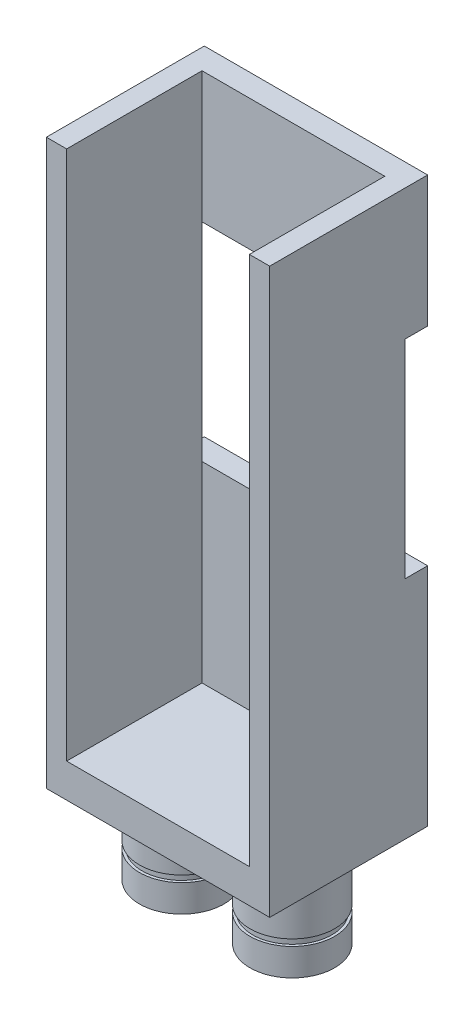
ISO-10303-21;
HEADER;
FILE_DESCRIPTION(('STEP AP214'),'2;1');
FILE_NAME('part.step','',(''),(''),'','','');
FILE_SCHEMA(('AUTOMOTIVE_DESIGN { 1 0 10303 214 1 1 1 1 }'));
ENDSEC;
DATA;
#1=APPLICATION_CONTEXT('core data for automotive mechanical design processes');
#2=APPLICATION_PROTOCOL_DEFINITION('international standard','automotive_design',2000,#1);
#3=PRODUCT_CONTEXT('',#1,'mechanical');
#4=PRODUCT('Part','Part','',(#3));
#5=PRODUCT_RELATED_PRODUCT_CATEGORY('part','',(#4));
#6=PRODUCT_DEFINITION_FORMATION('','',#4);
#7=PRODUCT_DEFINITION_CONTEXT('part definition',#1,'design');
#8=PRODUCT_DEFINITION('design','',#6,#7);
#9=PRODUCT_DEFINITION_SHAPE('','',#8);
#10=(LENGTH_UNIT() NAMED_UNIT(*) SI_UNIT(.MILLI.,.METRE.));
#11=(NAMED_UNIT(*) PLANE_ANGLE_UNIT() SI_UNIT($,.RADIAN.));
#12=(NAMED_UNIT(*) SI_UNIT($,.STERADIAN.) SOLID_ANGLE_UNIT());
#13=UNCERTAINTY_MEASURE_WITH_UNIT(LENGTH_MEASURE(1.E-05),#10,'distance_accuracy_value','');
#14=(GEOMETRIC_REPRESENTATION_CONTEXT(3) GLOBAL_UNCERTAINTY_ASSIGNED_CONTEXT((#13)) GLOBAL_UNIT_ASSIGNED_CONTEXT((#10,
#11,#12)) REPRESENTATION_CONTEXT('',''));
#15=CARTESIAN_POINT('',(0.,0.,0.));
#16=DIRECTION('',(0.,0.,1.));
#17=DIRECTION('',(1.,0.,0.));
#18=AXIS2_PLACEMENT_3D('',#15,#16,#17);
#19=CARTESIAN_POINT('',(-12.573,63.5,-8.89));
#20=DIRECTION('',(0.,0.,1.));
#21=DIRECTION('',(1.,0.,0.));
#22=AXIS2_PLACEMENT_3D('',#19,#20,#21);
#23=PLANE('',#22);
#24=DIRECTION('',(0.,-1.,0.));
#25=VECTOR('',#24,1.);
#26=CARTESIAN_POINT('',(12.573,63.5,-8.89));
#27=LINE('',#26,#25);
#28=CARTESIAN_POINT('',(12.573,63.5,-8.89));
#29=VERTEX_POINT('',#28);
#30=CARTESIAN_POINT('',(12.573,48.768,-8.89));
#31=VERTEX_POINT('',#30);
#32=EDGE_CURVE('E170',#29,#31,#27,.T.);
#33=ORIENTED_EDGE('',*,*,#32,.T.);
#34=DIRECTION('',(1.,0.,0.));
#35=VECTOR('',#34,1.);
#36=CARTESIAN_POINT('',(12.573,48.768,-8.89));
#37=LINE('',#36,#35);
#38=CARTESIAN_POINT('',(-12.573,48.768,-8.89));
#39=VERTEX_POINT('',#38);
#40=EDGE_CURVE('E144',#39,#31,#37,.T.);
#41=ORIENTED_EDGE('',*,*,#40,.F.);
#42=DIRECTION('',(0.,-1.,0.));
#43=VECTOR('',#42,1.);
#44=CARTESIAN_POINT('',(-12.573,63.5,-8.89));
#45=LINE('',#44,#43);
#46=CARTESIAN_POINT('',(-12.573,63.5,-8.89));
#47=VERTEX_POINT('',#46);
#48=EDGE_CURVE('E162',#47,#39,#45,.T.);
#49=ORIENTED_EDGE('',*,*,#48,.F.);
#50=DIRECTION('',(-1.,0.,0.));
#51=VECTOR('',#50,1.);
#52=CARTESIAN_POINT('',(-12.573,63.5,-8.89));
#53=LINE('',#52,#51);
#54=EDGE_CURVE('E181',#29,#47,#53,.T.);
#55=ORIENTED_EDGE('',*,*,#54,.F.);
#56=EDGE_LOOP('',(#33,#41,#49,#55));
#57=FACE_BOUND('',#56,.T.);
#58=ADVANCED_FACE('F36',(#57),#23,.F.);
#59=CARTESIAN_POINT('',(-10.287,3.81,-6.35));
#60=DIRECTION('',(0.,0.,-1.));
#61=DIRECTION('',(-1.,0.,0.));
#62=AXIS2_PLACEMENT_3D('',#59,#60,#61);
#63=PLANE('',#62);
#64=DIRECTION('',(0.,1.,0.));
#65=VECTOR('',#64,1.);
#66=CARTESIAN_POINT('',(-10.287,3.81,-6.35));
#67=LINE('',#66,#65);
#68=CARTESIAN_POINT('',(-10.287,48.768,-6.35));
#69=VERTEX_POINT('',#68);
#70=CARTESIAN_POINT('',(-10.287,63.5,-6.35));
#71=VERTEX_POINT('',#70);
#72=EDGE_CURVE('E207',#69,#71,#67,.T.);
#73=ORIENTED_EDGE('',*,*,#72,.F.);
#74=DIRECTION('',(-1.,0.,0.));
#75=VECTOR('',#74,1.);
#76=CARTESIAN_POINT('',(12.573,48.768,-6.35));
#77=LINE('',#76,#75);
#78=CARTESIAN_POINT('',(10.287,48.768,-6.35));
#79=VERTEX_POINT('',#78);
#80=EDGE_CURVE('E247',#79,#69,#77,.T.);
#81=ORIENTED_EDGE('',*,*,#80,.F.);
#82=DIRECTION('',(0.,1.,0.));
#83=VECTOR('',#82,1.);
#84=CARTESIAN_POINT('',(10.287,3.81,-6.35));
#85=LINE('',#84,#83);
#86=CARTESIAN_POINT('',(10.287,63.5,-6.35));
#87=VERTEX_POINT('',#86);
#88=EDGE_CURVE('E202',#79,#87,#85,.T.);
#89=ORIENTED_EDGE('',*,*,#88,.T.);
#90=DIRECTION('',(-1.,0.,0.));
#91=VECTOR('',#90,1.);
#92=CARTESIAN_POINT('',(-10.287,63.5,-6.35));
#93=LINE('',#92,#91);
#94=EDGE_CURVE('E206',#87,#71,#93,.T.);
#95=ORIENTED_EDGE('',*,*,#94,.T.);
#96=EDGE_LOOP('',(#73,#81,#89,#95));
#97=FACE_BOUND('',#96,.T.);
#98=ADVANCED_FACE('F243',(#97),#63,.F.);
#99=CARTESIAN_POINT('',(-6.223,-10.16,0.));
#100=DIRECTION('',(0.,1.,0.));
#101=DIRECTION('',(0.,0.,1.));
#102=AXIS2_PLACEMENT_3D('',#99,#100,#101);
#103=CYLINDRICAL_SURFACE('',#102,4.7625);
#104=CARTESIAN_POINT('',(-6.223,0.,0.));
#105=DIRECTION('',(0.,1.,0.));
#106=DIRECTION('',(0.,0.,1.));
#107=AXIS2_PLACEMENT_3D('',#104,#105,#106);
#108=CIRCLE('',#107,4.7625);
#109=CARTESIAN_POINT('',(-6.223,0.,4.7625));
#110=VERTEX_POINT('',#109);
#111=EDGE_CURVE('E299',#110,#110,#108,.F.);
#112=ORIENTED_EDGE('',*,*,#111,.T.);
#113=EDGE_LOOP('',(#112));
#114=FACE_BOUND('',#113,.T.);
#115=CARTESIAN_POINT('',(-6.223,-6.35,0.));
#116=DIRECTION('',(0.,-1.,0.));
#117=DIRECTION('',(0.,0.,-1.));
#118=AXIS2_PLACEMENT_3D('',#115,#116,#117);
#119=CIRCLE('',#118,4.7625);
#120=CARTESIAN_POINT('',(-6.223,-6.35,-4.7625));
#121=VERTEX_POINT('',#120);
#122=EDGE_CURVE('E296',#121,#121,#119,.T.);
#123=ORIENTED_EDGE('',*,*,#122,.F.);
#124=EDGE_LOOP('',(#123));
#125=FACE_BOUND('',#124,.T.);
#126=ADVANCED_FACE('F326',(#114,#125),#103,.T.);
#127=CARTESIAN_POINT('',(6.223,-10.16,0.));
#128=DIRECTION('',(0.,1.,0.));
#129=DIRECTION('',(0.,0.,1.));
#130=AXIS2_PLACEMENT_3D('',#127,#128,#129);
#131=CYLINDRICAL_SURFACE('',#130,4.7625);
#132=CARTESIAN_POINT('',(6.223,0.,0.));
#133=DIRECTION('',(0.,1.,0.));
#134=DIRECTION('',(0.,0.,1.));
#135=AXIS2_PLACEMENT_3D('',#132,#133,#134);
#136=CIRCLE('',#135,4.7625);
#137=CARTESIAN_POINT('',(6.223,0.,4.7625));
#138=VERTEX_POINT('',#137);
#139=EDGE_CURVE('E166',#138,#138,#136,.F.);
#140=ORIENTED_EDGE('',*,*,#139,.T.);
#141=EDGE_LOOP('',(#140));
#142=FACE_BOUND('',#141,.T.);
#143=CARTESIAN_POINT('',(6.223,-6.35,0.));
#144=DIRECTION('',(0.,-1.,0.));
#145=DIRECTION('',(0.,0.,-1.));
#146=AXIS2_PLACEMENT_3D('',#143,#144,#145);
#147=CIRCLE('',#146,4.7625);
#148=CARTESIAN_POINT('',(6.223,-6.35,-4.7625));
#149=VERTEX_POINT('',#148);
#150=EDGE_CURVE('E216',#149,#149,#147,.T.);
#151=ORIENTED_EDGE('',*,*,#150,.F.);
#152=EDGE_LOOP('',(#151));
#153=FACE_BOUND('',#152,.T.);
#154=ADVANCED_FACE('F38',(#142,#153),#131,.T.);
#155=CARTESIAN_POINT('',(-12.573,63.5,-8.89));
#156=DIRECTION('',(1.,0.,0.));
#157=DIRECTION('',(0.,0.,-1.));
#158=AXIS2_PLACEMENT_3D('',#155,#156,#157);
#159=PLANE('',#158);
#160=ORIENTED_EDGE('',*,*,#48,.T.);
#161=DIRECTION('',(0.,0.,-1.));
#162=VECTOR('',#161,1.);
#163=CARTESIAN_POINT('',(-12.573,48.768,27.9776090049977));
#164=LINE('',#163,#162);
#165=CARTESIAN_POINT('',(-12.573,48.768,-6.35));
#166=VERTEX_POINT('',#165);
#167=EDGE_CURVE('E156',#166,#39,#164,.T.);
#168=ORIENTED_EDGE('',*,*,#167,.F.);
#169=DIRECTION('',(0.,-1.,0.));
#170=VECTOR('',#169,1.);
#171=CARTESIAN_POINT('',(-12.573,48.768,-6.35));
#172=LINE('',#171,#170);
#173=CARTESIAN_POINT('',(-12.573,25.4,-6.35));
#174=VERTEX_POINT('',#173);
#175=EDGE_CURVE('E155',#166,#174,#172,.T.);
#176=ORIENTED_EDGE('',*,*,#175,.T.);
#177=DIRECTION('',(0.,0.,-1.));
#178=VECTOR('',#177,1.);
#179=CARTESIAN_POINT('',(-12.573,25.4,27.9776090049977));
#180=LINE('',#179,#178);
#181=CARTESIAN_POINT('',(-12.573,25.4,-8.89));
#182=VERTEX_POINT('',#181);
#183=EDGE_CURVE('E139',#174,#182,#180,.T.);
#184=ORIENTED_EDGE('',*,*,#183,.T.);
#185=CARTESIAN_POINT('',(-12.573,0.,-8.89));
#186=VERTEX_POINT('',#185);
#187=EDGE_CURVE('E151',#182,#186,#45,.T.);
#188=ORIENTED_EDGE('',*,*,#187,.T.);
#189=DIRECTION('',(0.,0.,1.));
#190=VECTOR('',#189,1.);
#191=CARTESIAN_POINT('',(-12.573,0.,-8.89));
#192=LINE('',#191,#190);
#193=CARTESIAN_POINT('',(-12.573,0.,8.89));
#194=VERTEX_POINT('',#193);
#195=EDGE_CURVE('E163',#186,#194,#192,.T.);
#196=ORIENTED_EDGE('',*,*,#195,.T.);
#197=DIRECTION('',(0.,-1.,0.));
#198=VECTOR('',#197,1.);
#199=CARTESIAN_POINT('',(-12.573,63.5,8.89));
#200=LINE('',#199,#198);
#201=CARTESIAN_POINT('',(-12.573,63.5,8.89));
#202=VERTEX_POINT('',#201);
#203=EDGE_CURVE('E179',#202,#194,#200,.T.);
#204=ORIENTED_EDGE('',*,*,#203,.F.);
#205=DIRECTION('',(0.,0.,1.));
#206=VECTOR('',#205,1.);
#207=CARTESIAN_POINT('',(-12.573,63.5,-8.89));
#208=LINE('',#207,#206);
#209=EDGE_CURVE('E183',#47,#202,#208,.T.);
#210=ORIENTED_EDGE('',*,*,#209,.F.);
#211=EDGE_LOOP('',(#160,#168,#176,#184,#188,#196,#204,#210));
#212=FACE_BOUND('',#211,.T.);
#213=ADVANCED_FACE('F149',(#212),#159,.F.);
#214=CARTESIAN_POINT('',(-12.573,63.5,8.89));
#215=DIRECTION('',(0.,0.,-1.));
#216=DIRECTION('',(-1.,0.,0.));
#217=AXIS2_PLACEMENT_3D('',#214,#215,#216);
#218=PLANE('',#217);
#219=DIRECTION('',(1.,0.,0.));
#220=VECTOR('',#219,1.);
#221=CARTESIAN_POINT('',(-10.287,3.81,8.89));
#222=LINE('',#221,#220);
#223=CARTESIAN_POINT('',(-10.287,3.81,8.89));
#224=VERTEX_POINT('',#223);
#225=CARTESIAN_POINT('',(10.287,3.81,8.89));
#226=VERTEX_POINT('',#225);
#227=EDGE_CURVE('E219',#224,#226,#222,.T.);
#228=ORIENTED_EDGE('',*,*,#227,.F.);
#229=DIRECTION('',(0.,1.,0.));
#230=VECTOR('',#229,1.);
#231=CARTESIAN_POINT('',(-10.287,3.81,8.89));
#232=LINE('',#231,#230);
#233=CARTESIAN_POINT('',(-10.287,63.5,8.89));
#234=VERTEX_POINT('',#233);
#235=EDGE_CURVE('E165',#224,#234,#232,.T.);
#236=ORIENTED_EDGE('',*,*,#235,.T.);
#237=DIRECTION('',(1.,0.,0.));
#238=VECTOR('',#237,1.);
#239=CARTESIAN_POINT('',(-12.573,63.5,8.89));
#240=LINE('',#239,#238);
#241=EDGE_CURVE('E187',#202,#234,#240,.T.);
#242=ORIENTED_EDGE('',*,*,#241,.F.);
#243=ORIENTED_EDGE('',*,*,#203,.T.);
#244=DIRECTION('',(1.,0.,0.));
#245=VECTOR('',#244,1.);
#246=CARTESIAN_POINT('',(-12.573,0.,8.89));
#247=LINE('',#246,#245);
#248=CARTESIAN_POINT('',(12.573,0.,8.89));
#249=VERTEX_POINT('',#248);
#250=EDGE_CURVE('E178',#194,#249,#247,.T.);
#251=ORIENTED_EDGE('',*,*,#250,.T.);
#252=DIRECTION('',(0.,-1.,0.));
#253=VECTOR('',#252,1.);
#254=CARTESIAN_POINT('',(12.573,63.5,8.89));
#255=LINE('',#254,#253);
#256=CARTESIAN_POINT('',(12.573,63.5,8.89));
#257=VERTEX_POINT('',#256);
#258=EDGE_CURVE('E174',#257,#249,#255,.T.);
#259=ORIENTED_EDGE('',*,*,#258,.F.);
#260=CARTESIAN_POINT('',(10.287,63.5,8.89));
#261=VERTEX_POINT('',#260);
#262=EDGE_CURVE('E186',#261,#257,#240,.T.);
#263=ORIENTED_EDGE('',*,*,#262,.F.);
#264=DIRECTION('',(0.,1.,0.));
#265=VECTOR('',#264,1.);
#266=CARTESIAN_POINT('',(10.287,3.81,8.89));
#267=LINE('',#266,#265);
#268=EDGE_CURVE('E195',#226,#261,#267,.T.);
#269=ORIENTED_EDGE('',*,*,#268,.F.);
#270=EDGE_LOOP('',(#228,#236,#242,#243,#251,#259,#263,#269));
#271=FACE_BOUND('',#270,.T.);
#272=ADVANCED_FACE('F230',(#271),#218,.F.);
#273=CARTESIAN_POINT('',(12.573,63.5,-8.89));
#274=DIRECTION('',(-1.,0.,0.));
#275=DIRECTION('',(0.,0.,1.));
#276=AXIS2_PLACEMENT_3D('',#273,#274,#275);
#277=PLANE('',#276);
#278=DIRECTION('',(0.,1.,0.));
#279=VECTOR('',#278,1.);
#280=CARTESIAN_POINT('',(12.573,48.768,-6.35));
#281=LINE('',#280,#279);
#282=CARTESIAN_POINT('',(12.573,25.4,-6.35));
#283=VERTEX_POINT('',#282);
#284=CARTESIAN_POINT('',(12.573,48.768,-6.35));
#285=VERTEX_POINT('',#284);
#286=EDGE_CURVE('E261',#283,#285,#281,.T.);
#287=ORIENTED_EDGE('',*,*,#286,.T.);
#288=DIRECTION('',(0.,0.,-1.));
#289=VECTOR('',#288,1.);
#290=CARTESIAN_POINT('',(12.573,48.768,27.9776090049977));
#291=LINE('',#290,#289);
#292=EDGE_CURVE('E259',#285,#31,#291,.T.);
#293=ORIENTED_EDGE('',*,*,#292,.T.);
#294=ORIENTED_EDGE('',*,*,#32,.F.);
#295=DIRECTION('',(0.,0.,-1.));
#296=VECTOR('',#295,1.);
#297=CARTESIAN_POINT('',(12.573,63.5,-8.89));
#298=LINE('',#297,#296);
#299=EDGE_CURVE('E184',#257,#29,#298,.T.);
#300=ORIENTED_EDGE('',*,*,#299,.F.);
#301=ORIENTED_EDGE('',*,*,#258,.T.);
#302=DIRECTION('',(0.,0.,-1.));
#303=VECTOR('',#302,1.);
#304=CARTESIAN_POINT('',(12.573,0.,-8.89));
#305=LINE('',#304,#303);
#306=CARTESIAN_POINT('',(12.573,0.,-8.89));
#307=VERTEX_POINT('',#306);
#308=EDGE_CURVE('E175',#249,#307,#305,.T.);
#309=ORIENTED_EDGE('',*,*,#308,.T.);
#310=CARTESIAN_POINT('',(12.573,25.4,-8.89));
#311=VERTEX_POINT('',#310);
#312=EDGE_CURVE('E173',#311,#307,#27,.T.);
#313=ORIENTED_EDGE('',*,*,#312,.F.);
#314=DIRECTION('',(0.,0.,-1.));
#315=VECTOR('',#314,1.);
#316=CARTESIAN_POINT('',(12.573,25.4,27.9776090049977));
#317=LINE('',#316,#315);
#318=EDGE_CURVE('E53',#283,#311,#317,.T.);
#319=ORIENTED_EDGE('',*,*,#318,.F.);
#320=EDGE_LOOP('',(#287,#293,#294,#300,#301,#309,#313,#319));
#321=FACE_BOUND('',#320,.T.);
#322=ADVANCED_FACE('F312',(#321),#277,.F.);
#323=ORIENTED_EDGE('',*,*,#187,.F.);
#324=DIRECTION('',(-1.,0.,0.));
#325=VECTOR('',#324,1.);
#326=CARTESIAN_POINT('',(12.573,25.4,-8.89));
#327=LINE('',#326,#325);
#328=EDGE_CURVE('E136',#311,#182,#327,.T.);
#329=ORIENTED_EDGE('',*,*,#328,.F.);
#330=ORIENTED_EDGE('',*,*,#312,.T.);
#331=DIRECTION('',(-1.,0.,0.));
#332=VECTOR('',#331,1.);
#333=CARTESIAN_POINT('',(-12.573,0.,-8.89));
#334=LINE('',#333,#332);
#335=EDGE_CURVE('E160',#307,#186,#334,.T.);
#336=ORIENTED_EDGE('',*,*,#335,.T.);
#337=EDGE_LOOP('',(#323,#329,#330,#336));
#338=FACE_BOUND('',#337,.T.);
#339=ADVANCED_FACE('F158',(#338),#23,.F.);
#340=CARTESIAN_POINT('',(0.,63.5,0.));
#341=DIRECTION('',(0.,1.,0.));
#342=DIRECTION('',(0.,0.,1.));
#343=AXIS2_PLACEMENT_3D('',#340,#341,#342);
#344=PLANE('',#343);
#345=DIRECTION('',(0.,0.,1.));
#346=VECTOR('',#345,1.);
#347=CARTESIAN_POINT('',(-10.287,63.5,-6.35));
#348=LINE('',#347,#346);
#349=EDGE_CURVE('E190',#71,#234,#348,.T.);
#350=ORIENTED_EDGE('',*,*,#349,.F.);
#351=ORIENTED_EDGE('',*,*,#94,.F.);
#352=DIRECTION('',(0.,0.,-1.));
#353=VECTOR('',#352,1.);
#354=CARTESIAN_POINT('',(10.287,63.5,-6.35));
#355=LINE('',#354,#353);
#356=EDGE_CURVE('E197',#261,#87,#355,.T.);
#357=ORIENTED_EDGE('',*,*,#356,.F.);
#358=ORIENTED_EDGE('',*,*,#262,.T.);
#359=ORIENTED_EDGE('',*,*,#299,.T.);
#360=ORIENTED_EDGE('',*,*,#54,.T.);
#361=ORIENTED_EDGE('',*,*,#209,.T.);
#362=ORIENTED_EDGE('',*,*,#241,.T.);
#363=EDGE_LOOP('',(#350,#351,#357,#358,#359,#360,#361,#362));
#364=FACE_BOUND('',#363,.T.);
#365=ADVANCED_FACE('F240',(#364),#344,.T.);
#366=CARTESIAN_POINT('',(0.,0.,0.));
#367=DIRECTION('',(0.,1.,0.));
#368=DIRECTION('',(0.,0.,1.));
#369=AXIS2_PLACEMENT_3D('',#366,#367,#368);
#370=PLANE('',#369);
#371=ORIENTED_EDGE('',*,*,#139,.F.);
#372=EDGE_LOOP('',(#371));
#373=FACE_BOUND('',#372,.T.);
#374=ORIENTED_EDGE('',*,*,#111,.F.);
#375=EDGE_LOOP('',(#374));
#376=FACE_BOUND('',#375,.T.);
#377=ORIENTED_EDGE('',*,*,#195,.F.);
#378=ORIENTED_EDGE('',*,*,#335,.F.);
#379=ORIENTED_EDGE('',*,*,#308,.F.);
#380=ORIENTED_EDGE('',*,*,#250,.F.);
#381=EDGE_LOOP('',(#377,#378,#379,#380));
#382=FACE_BOUND('',#381,.T.);
#383=ADVANCED_FACE('F314',(#373,#376,#382),#370,.F.);
#384=CARTESIAN_POINT('',(-10.287,3.81,-6.35));
#385=DIRECTION('',(-1.,0.,0.));
#386=DIRECTION('',(0.,0.,1.));
#387=AXIS2_PLACEMENT_3D('',#384,#385,#386);
#388=PLANE('',#387);
#389=ORIENTED_EDGE('',*,*,#349,.T.);
#390=ORIENTED_EDGE('',*,*,#235,.F.);
#391=DIRECTION('',(0.,0.,1.));
#392=VECTOR('',#391,1.);
#393=CARTESIAN_POINT('',(-10.287,3.81,-6.35));
#394=LINE('',#393,#392);
#395=CARTESIAN_POINT('',(-10.287,3.81,-6.35));
#396=VERTEX_POINT('',#395);
#397=EDGE_CURVE('E40',#396,#224,#394,.T.);
#398=ORIENTED_EDGE('',*,*,#397,.F.);
#399=CARTESIAN_POINT('',(-10.287,25.4,-6.35));
#400=VERTEX_POINT('',#399);
#401=EDGE_CURVE('E203',#396,#400,#67,.T.);
#402=ORIENTED_EDGE('',*,*,#401,.T.);
#403=DIRECTION('',(0.,-1.,0.));
#404=VECTOR('',#403,1.);
#405=CARTESIAN_POINT('',(-10.287,3.81,-6.35));
#406=LINE('',#405,#404);
#407=EDGE_CURVE('E276',#69,#400,#406,.T.);
#408=ORIENTED_EDGE('',*,*,#407,.F.);
#409=ORIENTED_EDGE('',*,*,#72,.T.);
#410=EDGE_LOOP('',(#389,#390,#398,#402,#408,#409));
#411=FACE_BOUND('',#410,.T.);
#412=ADVANCED_FACE('F388',(#411),#388,.F.);
#413=CARTESIAN_POINT('',(10.287,3.81,-6.35));
#414=VERTEX_POINT('',#413);
#415=CARTESIAN_POINT('',(10.287,25.4,-6.35));
#416=VERTEX_POINT('',#415);
#417=EDGE_CURVE('E198',#414,#416,#85,.T.);
#418=ORIENTED_EDGE('',*,*,#417,.T.);
#419=DIRECTION('',(1.,0.,0.));
#420=VECTOR('',#419,1.);
#421=CARTESIAN_POINT('',(12.573,25.4,-6.35));
#422=LINE('',#421,#420);
#423=EDGE_CURVE('E59',#400,#416,#422,.T.);
#424=ORIENTED_EDGE('',*,*,#423,.F.);
#425=ORIENTED_EDGE('',*,*,#401,.F.);
#426=DIRECTION('',(-1.,0.,0.));
#427=VECTOR('',#426,1.);
#428=CARTESIAN_POINT('',(-10.287,3.81,-6.35));
#429=LINE('',#428,#427);
#430=EDGE_CURVE('E213',#414,#396,#429,.T.);
#431=ORIENTED_EDGE('',*,*,#430,.F.);
#432=EDGE_LOOP('',(#418,#424,#425,#431));
#433=FACE_BOUND('',#432,.T.);
#434=ADVANCED_FACE('F328',(#433),#63,.F.);
#435=CARTESIAN_POINT('',(10.287,3.81,-6.35));
#436=DIRECTION('',(1.,0.,0.));
#437=DIRECTION('',(0.,0.,-1.));
#438=AXIS2_PLACEMENT_3D('',#435,#436,#437);
#439=PLANE('',#438);
#440=ORIENTED_EDGE('',*,*,#356,.T.);
#441=ORIENTED_EDGE('',*,*,#88,.F.);
#442=EDGE_CURVE('E201',#416,#79,#85,.T.);
#443=ORIENTED_EDGE('',*,*,#442,.F.);
#444=ORIENTED_EDGE('',*,*,#417,.F.);
#445=DIRECTION('',(0.,0.,-1.));
#446=VECTOR('',#445,1.);
#447=CARTESIAN_POINT('',(10.287,3.81,-6.35));
#448=LINE('',#447,#446);
#449=EDGE_CURVE('E217',#226,#414,#448,.T.);
#450=ORIENTED_EDGE('',*,*,#449,.F.);
#451=ORIENTED_EDGE('',*,*,#268,.T.);
#452=EDGE_LOOP('',(#440,#441,#443,#444,#450,#451));
#453=FACE_BOUND('',#452,.T.);
#454=ADVANCED_FACE('F235',(#453),#439,.F.);
#455=CARTESIAN_POINT('',(0.,3.81,0.));
#456=DIRECTION('',(0.,1.,0.));
#457=DIRECTION('',(0.,0.,1.));
#458=AXIS2_PLACEMENT_3D('',#455,#456,#457);
#459=PLANE('',#458);
#460=ORIENTED_EDGE('',*,*,#397,.T.);
#461=ORIENTED_EDGE('',*,*,#227,.T.);
#462=ORIENTED_EDGE('',*,*,#449,.T.);
#463=ORIENTED_EDGE('',*,*,#430,.T.);
#464=EDGE_LOOP('',(#460,#461,#462,#463));
#465=FACE_BOUND('',#464,.T.);
#466=ADVANCED_FACE('F226',(#465),#459,.T.);
#467=CARTESIAN_POINT('',(0.,-6.35,0.));
#468=DIRECTION('',(0.,-1.,0.));
#469=DIRECTION('',(0.,0.,-1.));
#470=AXIS2_PLACEMENT_3D('',#467,#468,#469);
#471=PLANE('',#470);
#472=CARTESIAN_POINT('',(6.223,-6.35,0.));
#473=DIRECTION('',(0.,-1.,0.));
#474=DIRECTION('',(0.,0.,-1.));
#475=AXIS2_PLACEMENT_3D('',#472,#473,#474);
#476=CIRCLE('',#475,4.4704);
#477=CARTESIAN_POINT('',(6.223,-6.35,-4.4704));
#478=VERTEX_POINT('',#477);
#479=EDGE_CURVE('E12',#478,#478,#476,.T.);
#480=ORIENTED_EDGE('',*,*,#479,.F.);
#481=EDGE_LOOP('',(#480));
#482=FACE_BOUND('',#481,.T.);
#483=ORIENTED_EDGE('',*,*,#150,.T.);
#484=EDGE_LOOP('',(#483));
#485=FACE_BOUND('',#484,.T.);
#486=ADVANCED_FACE('F401',(#482,#485),#471,.T.);
#487=CARTESIAN_POINT('',(0.,-6.35,0.));
#488=DIRECTION('',(0.,-1.,0.));
#489=DIRECTION('',(0.,0.,-1.));
#490=AXIS2_PLACEMENT_3D('',#487,#488,#489);
#491=PLANE('',#490);
#492=CARTESIAN_POINT('',(-6.223,-6.35,0.));
#493=DIRECTION('',(0.,-1.,0.));
#494=DIRECTION('',(0.,0.,-1.));
#495=AXIS2_PLACEMENT_3D('',#492,#493,#494);
#496=CIRCLE('',#495,4.4577);
#497=CARTESIAN_POINT('',(-6.223,-6.35,-4.4577));
#498=VERTEX_POINT('',#497);
#499=EDGE_CURVE('E45',#498,#498,#496,.T.);
#500=ORIENTED_EDGE('',*,*,#499,.F.);
#501=EDGE_LOOP('',(#500));
#502=FACE_BOUND('',#501,.T.);
#503=ORIENTED_EDGE('',*,*,#122,.T.);
#504=EDGE_LOOP('',(#503));
#505=FACE_BOUND('',#504,.T.);
#506=ADVANCED_FACE('F348',(#502,#505),#491,.T.);
#507=CARTESIAN_POINT('',(-6.223,-19.7308006184654,0.));
#508=DIRECTION('',(0.,1.,0.));
#509=DIRECTION('',(0.,0.,1.));
#510=AXIS2_PLACEMENT_3D('',#507,#508,#509);
#511=CYLINDRICAL_SURFACE('',#510,4.4577);
#512=ORIENTED_EDGE('',*,*,#499,.T.);
#513=EDGE_LOOP('',(#512));
#514=FACE_BOUND('',#513,.T.);
#515=CARTESIAN_POINT('',(-6.223,-7.0866,0.));
#516=DIRECTION('',(0.,-1.,0.));
#517=DIRECTION('',(0.,0.,-1.));
#518=AXIS2_PLACEMENT_3D('',#515,#516,#517);
#519=CIRCLE('',#518,4.4577);
#520=CARTESIAN_POINT('',(-6.223,-7.0866,-4.4577));
#521=VERTEX_POINT('',#520);
#522=EDGE_CURVE('E291',#521,#521,#519,.T.);
#523=ORIENTED_EDGE('',*,*,#522,.F.);
#524=EDGE_LOOP('',(#523));
#525=FACE_BOUND('',#524,.T.);
#526=ADVANCED_FACE('F344',(#514,#525),#511,.T.);
#527=CARTESIAN_POINT('',(-6.223,-10.16,0.));
#528=DIRECTION('',(0.,-1.,0.));
#529=DIRECTION('',(0.,0.,-1.));
#530=AXIS2_PLACEMENT_3D('',#527,#528,#529);
#531=PLANE('',#530);
#532=CARTESIAN_POINT('',(-6.223,-10.16,0.));
#533=DIRECTION('',(0.,-1.,0.));
#534=DIRECTION('',(0.,0.,-1.));
#535=AXIS2_PLACEMENT_3D('',#532,#533,#534);
#536=CIRCLE('',#535,4.7625);
#537=CARTESIAN_POINT('',(-6.223,-10.16,-4.7625));
#538=VERTEX_POINT('',#537);
#539=EDGE_CURVE('E288',#538,#538,#536,.T.);
#540=ORIENTED_EDGE('',*,*,#539,.T.);
#541=EDGE_LOOP('',(#540));
#542=FACE_BOUND('',#541,.T.);
#543=ADVANCED_FACE('F347',(#542),#531,.T.);
#544=CARTESIAN_POINT('',(-6.223,-10.16,0.));
#545=DIRECTION('',(0.,1.,0.));
#546=DIRECTION('',(0.,0.,1.));
#547=AXIS2_PLACEMENT_3D('',#544,#545,#546);
#548=CYLINDRICAL_SURFACE('',#547,4.7625);
#549=CARTESIAN_POINT('',(-6.223,-7.0866,0.));
#550=DIRECTION('',(0.,-1.,0.));
#551=DIRECTION('',(0.,0.,-1.));
#552=AXIS2_PLACEMENT_3D('',#549,#550,#551);
#553=CIRCLE('',#552,4.7625);
#554=CARTESIAN_POINT('',(-6.223,-7.0866,-4.7625));
#555=VERTEX_POINT('',#554);
#556=EDGE_CURVE('E287',#555,#555,#553,.T.);
#557=ORIENTED_EDGE('',*,*,#556,.T.);
#558=EDGE_LOOP('',(#557));
#559=FACE_BOUND('',#558,.T.);
#560=ORIENTED_EDGE('',*,*,#539,.F.);
#561=EDGE_LOOP('',(#560));
#562=FACE_BOUND('',#561,.T.);
#563=ADVANCED_FACE('F350',(#559,#562),#548,.T.);
#564=CARTESIAN_POINT('',(0.,-7.0866,0.));
#565=DIRECTION('',(0.,-1.,0.));
#566=DIRECTION('',(0.,0.,-1.));
#567=AXIS2_PLACEMENT_3D('',#564,#565,#566);
#568=PLANE('',#567);
#569=ORIENTED_EDGE('',*,*,#522,.T.);
#570=EDGE_LOOP('',(#569));
#571=FACE_BOUND('',#570,.T.);
#572=ORIENTED_EDGE('',*,*,#556,.F.);
#573=EDGE_LOOP('',(#572));
#574=FACE_BOUND('',#573,.T.);
#575=ADVANCED_FACE('F353',(#571,#574),#568,.F.);
#576=CARTESIAN_POINT('',(6.223,-19.7308006184654,0.));
#577=DIRECTION('',(0.,1.,0.));
#578=DIRECTION('',(0.,0.,1.));
#579=AXIS2_PLACEMENT_3D('',#576,#577,#578);
#580=CYLINDRICAL_SURFACE('',#579,4.4704);
#581=ORIENTED_EDGE('',*,*,#479,.T.);
#582=EDGE_LOOP('',(#581));
#583=FACE_BOUND('',#582,.T.);
#584=CARTESIAN_POINT('',(6.223,-7.0866,0.));
#585=DIRECTION('',(0.,-1.,0.));
#586=DIRECTION('',(0.,0.,-1.));
#587=AXIS2_PLACEMENT_3D('',#584,#585,#586);
#588=CIRCLE('',#587,4.4704);
#589=CARTESIAN_POINT('',(6.223,-7.0866,-4.4704));
#590=VERTEX_POINT('',#589);
#591=EDGE_CURVE('E282',#590,#590,#588,.T.);
#592=ORIENTED_EDGE('',*,*,#591,.F.);
#593=EDGE_LOOP('',(#592));
#594=FACE_BOUND('',#593,.T.);
#595=ADVANCED_FACE('F360',(#583,#594),#580,.T.);
#596=CARTESIAN_POINT('',(6.223,-10.16,0.));
#597=DIRECTION('',(0.,-1.,0.));
#598=DIRECTION('',(0.,0.,-1.));
#599=AXIS2_PLACEMENT_3D('',#596,#597,#598);
#600=PLANE('',#599);
#601=CARTESIAN_POINT('',(6.223,-10.16,0.));
#602=DIRECTION('',(0.,-1.,0.));
#603=DIRECTION('',(0.,0.,-1.));
#604=AXIS2_PLACEMENT_3D('',#601,#602,#603);
#605=CIRCLE('',#604,4.7625);
#606=CARTESIAN_POINT('',(6.223,-10.16,-4.7625));
#607=VERTEX_POINT('',#606);
#608=EDGE_CURVE('E278',#607,#607,#605,.T.);
#609=ORIENTED_EDGE('',*,*,#608,.T.);
#610=EDGE_LOOP('',(#609));
#611=FACE_BOUND('',#610,.T.);
#612=ADVANCED_FACE('F364',(#611),#600,.T.);
#613=CARTESIAN_POINT('',(6.223,-10.16,0.));
#614=DIRECTION('',(0.,1.,0.));
#615=DIRECTION('',(0.,0.,1.));
#616=AXIS2_PLACEMENT_3D('',#613,#614,#615);
#617=CYLINDRICAL_SURFACE('',#616,4.7625);
#618=CARTESIAN_POINT('',(6.223,-7.0866,0.));
#619=DIRECTION('',(0.,-1.,0.));
#620=DIRECTION('',(0.,0.,-1.));
#621=AXIS2_PLACEMENT_3D('',#618,#619,#620);
#622=CIRCLE('',#621,4.7625);
#623=CARTESIAN_POINT('',(6.223,-7.0866,-4.7625));
#624=VERTEX_POINT('',#623);
#625=EDGE_CURVE('E279',#624,#624,#622,.T.);
#626=ORIENTED_EDGE('',*,*,#625,.T.);
#627=EDGE_LOOP('',(#626));
#628=FACE_BOUND('',#627,.T.);
#629=ORIENTED_EDGE('',*,*,#608,.F.);
#630=EDGE_LOOP('',(#629));
#631=FACE_BOUND('',#630,.T.);
#632=ADVANCED_FACE('F370',(#628,#631),#617,.T.);
#633=CARTESIAN_POINT('',(0.,-7.0866,0.));
#634=DIRECTION('',(0.,-1.,0.));
#635=DIRECTION('',(0.,0.,-1.));
#636=AXIS2_PLACEMENT_3D('',#633,#634,#635);
#637=PLANE('',#636);
#638=ORIENTED_EDGE('',*,*,#591,.T.);
#639=EDGE_LOOP('',(#638));
#640=FACE_BOUND('',#639,.T.);
#641=ORIENTED_EDGE('',*,*,#625,.F.);
#642=EDGE_LOOP('',(#641));
#643=FACE_BOUND('',#642,.T.);
#644=ADVANCED_FACE('F366',(#640,#643),#637,.F.);
#645=CARTESIAN_POINT('',(-10.287,3.81,-6.35));
#646=DIRECTION('',(0.,0.,-1.));
#647=DIRECTION('',(-1.,0.,0.));
#648=AXIS2_PLACEMENT_3D('',#645,#646,#647);
#649=PLANE('',#648);
#650=ORIENTED_EDGE('',*,*,#407,.T.);
#651=EDGE_CURVE('E274',#174,#400,#422,.T.);
#652=ORIENTED_EDGE('',*,*,#651,.F.);
#653=ORIENTED_EDGE('',*,*,#175,.F.);
#654=EDGE_CURVE('E263',#69,#166,#77,.T.);
#655=ORIENTED_EDGE('',*,*,#654,.F.);
#656=EDGE_LOOP('',(#650,#652,#653,#655));
#657=FACE_BOUND('',#656,.T.);
#658=ADVANCED_FACE('F369',(#657),#649,.T.);
#659=ORIENTED_EDGE('',*,*,#442,.T.);
#660=EDGE_CURVE('E253',#285,#79,#77,.T.);
#661=ORIENTED_EDGE('',*,*,#660,.F.);
#662=ORIENTED_EDGE('',*,*,#286,.F.);
#663=EDGE_CURVE('E255',#416,#283,#422,.T.);
#664=ORIENTED_EDGE('',*,*,#663,.F.);
#665=EDGE_LOOP('',(#659,#661,#662,#664));
#666=FACE_BOUND('',#665,.T.);
#667=ADVANCED_FACE('F251',(#666),#649,.T.);
#668=CARTESIAN_POINT('',(12.573,48.768,27.9776090049977));
#669=DIRECTION('',(0.,1.,0.));
#670=DIRECTION('',(0.,0.,1.));
#671=AXIS2_PLACEMENT_3D('',#668,#669,#670);
#672=PLANE('',#671);
#673=ORIENTED_EDGE('',*,*,#660,.T.);
#674=ORIENTED_EDGE('',*,*,#80,.T.);
#675=ORIENTED_EDGE('',*,*,#654,.T.);
#676=ORIENTED_EDGE('',*,*,#167,.T.);
#677=ORIENTED_EDGE('',*,*,#40,.T.);
#678=ORIENTED_EDGE('',*,*,#292,.F.);
#679=EDGE_LOOP('',(#673,#674,#675,#676,#677,#678));
#680=FACE_BOUND('',#679,.T.);
#681=ADVANCED_FACE('F257',(#680),#672,.F.);
#682=CARTESIAN_POINT('',(12.573,25.4,27.9776090049977));
#683=DIRECTION('',(0.,-1.,0.));
#684=DIRECTION('',(0.,0.,-1.));
#685=AXIS2_PLACEMENT_3D('',#682,#683,#684);
#686=PLANE('',#685);
#687=ORIENTED_EDGE('',*,*,#651,.T.);
#688=ORIENTED_EDGE('',*,*,#423,.T.);
#689=ORIENTED_EDGE('',*,*,#663,.T.);
#690=ORIENTED_EDGE('',*,*,#318,.T.);
#691=ORIENTED_EDGE('',*,*,#328,.T.);
#692=ORIENTED_EDGE('',*,*,#183,.F.);
#693=EDGE_LOOP('',(#687,#688,#689,#690,#691,#692));
#694=FACE_BOUND('',#693,.T.);
#695=ADVANCED_FACE('F138',(#694),#686,.F.);
#696=CLOSED_SHELL('',(#58,#98,#126,#154,#213,#272,#322,#339,#365,#383,#412,#434,#454,#466,#486,
#506,#526,#543,#563,#575,#595,#612,#632,#644,#658,#667,#681,#695));
#697=MANIFOLD_SOLID_BREP('B2',#696);
#698=ADVANCED_BREP_SHAPE_REPRESENTATION('',(#18,#697),#14);
#699=SHAPE_DEFINITION_REPRESENTATION(#9,#698);
ENDSEC;
END-ISO-10303-21;
